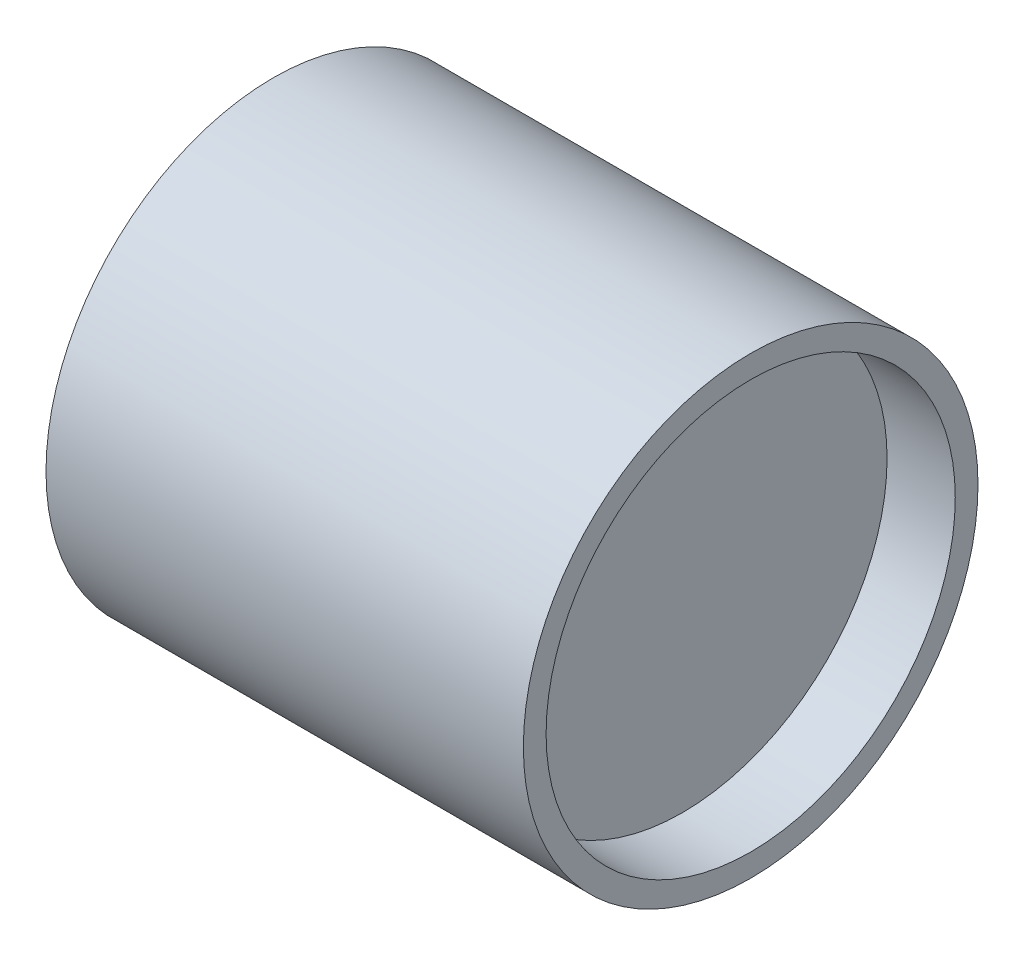
ISO-10303-21;
HEADER;
FILE_DESCRIPTION(('STEP AP214'),'2;1');
FILE_NAME('part.step','',(''),(''),'','','');
FILE_SCHEMA(('AUTOMOTIVE_DESIGN { 1 0 10303 214 1 1 1 1 }'));
ENDSEC;
DATA;
#1=APPLICATION_CONTEXT('core data for automotive mechanical design processes');
#2=APPLICATION_PROTOCOL_DEFINITION('international standard','automotive_design',2000,#1);
#3=PRODUCT_CONTEXT('',#1,'mechanical');
#4=PRODUCT('Part','Part','',(#3));
#5=PRODUCT_RELATED_PRODUCT_CATEGORY('part','',(#4));
#6=PRODUCT_DEFINITION_FORMATION('','',#4);
#7=PRODUCT_DEFINITION_CONTEXT('part definition',#1,'design');
#8=PRODUCT_DEFINITION('design','',#6,#7);
#9=PRODUCT_DEFINITION_SHAPE('','',#8);
#10=(LENGTH_UNIT() NAMED_UNIT(*) SI_UNIT(.MILLI.,.METRE.));
#11=(NAMED_UNIT(*) PLANE_ANGLE_UNIT() SI_UNIT($,.RADIAN.));
#12=(NAMED_UNIT(*) SI_UNIT($,.STERADIAN.) SOLID_ANGLE_UNIT());
#13=UNCERTAINTY_MEASURE_WITH_UNIT(LENGTH_MEASURE(1.E-05),#10,'distance_accuracy_value','');
#14=(GEOMETRIC_REPRESENTATION_CONTEXT(3) GLOBAL_UNCERTAINTY_ASSIGNED_CONTEXT((#13)) GLOBAL_UNIT_ASSIGNED_CONTEXT((#10,
#11,#12)) REPRESENTATION_CONTEXT('',''));
#15=CARTESIAN_POINT('',(0.,0.,0.));
#16=DIRECTION('',(0.,0.,1.));
#17=DIRECTION('',(1.,0.,0.));
#18=AXIS2_PLACEMENT_3D('',#15,#16,#17);
#19=CARTESIAN_POINT('',(-30.,0.,0.));
#20=DIRECTION('',(-1.,0.,0.));
#21=DIRECTION('',(0.,0.,1.));
#22=AXIS2_PLACEMENT_3D('',#19,#20,#21);
#23=CYLINDRICAL_SURFACE('',#22,9.);
#24=CARTESIAN_POINT('',(-10.,0.,0.));
#25=DIRECTION('',(-1.,0.,0.));
#26=DIRECTION('',(0.,0.,1.));
#27=AXIS2_PLACEMENT_3D('',#24,#25,#26);
#28=CIRCLE('',#27,9.);
#29=CARTESIAN_POINT('',(-10.,0.,9.));
#30=VERTEX_POINT('',#29);
#31=EDGE_CURVE('E10',#30,#30,#28,.T.);
#32=ORIENTED_EDGE('',*,*,#31,.F.);
#33=EDGE_LOOP('',(#32));
#34=FACE_BOUND('',#33,.T.);
#35=CARTESIAN_POINT('',(-13.,0.,0.));
#36=DIRECTION('',(-1.,0.,0.));
#37=DIRECTION('',(0.,0.,1.));
#38=AXIS2_PLACEMENT_3D('',#35,#36,#37);
#39=CIRCLE('',#38,9.);
#40=CARTESIAN_POINT('',(-13.,0.,9.));
#41=VERTEX_POINT('',#40);
#42=EDGE_CURVE('E53',#41,#41,#39,.T.);
#43=ORIENTED_EDGE('',*,*,#42,.T.);
#44=EDGE_LOOP('',(#43));
#45=FACE_BOUND('',#44,.T.);
#46=ADVANCED_FACE('F31',(#34,#45),#23,.F.);
#47=CARTESIAN_POINT('',(-10.,10.,0.));
#48=DIRECTION('',(-1.,0.,0.));
#49=DIRECTION('',(0.,0.,1.));
#50=AXIS2_PLACEMENT_3D('',#47,#48,#49);
#51=PLANE('',#50);
#52=CARTESIAN_POINT('',(-10.,0.,0.));
#53=DIRECTION('',(-1.,0.,0.));
#54=DIRECTION('',(0.,0.,1.));
#55=AXIS2_PLACEMENT_3D('',#52,#53,#54);
#56=CIRCLE('',#55,10.);
#57=CARTESIAN_POINT('',(-10.,0.,10.));
#58=VERTEX_POINT('',#57);
#59=EDGE_CURVE('E37',#58,#58,#56,.T.);
#60=ORIENTED_EDGE('',*,*,#59,.F.);
#61=EDGE_LOOP('',(#60));
#62=FACE_BOUND('',#61,.T.);
#63=ORIENTED_EDGE('',*,*,#31,.T.);
#64=EDGE_LOOP('',(#63));
#65=FACE_BOUND('',#64,.T.);
#66=ADVANCED_FACE('F69',(#62,#65),#51,.F.);
#67=CARTESIAN_POINT('',(-30.,0.,0.));
#68=DIRECTION('',(-1.,0.,0.));
#69=DIRECTION('',(0.,0.,1.));
#70=AXIS2_PLACEMENT_3D('',#67,#68,#69);
#71=CYLINDRICAL_SURFACE('',#70,10.);
#72=CARTESIAN_POINT('',(-31.,0.,0.));
#73=DIRECTION('',(-1.,0.,0.));
#74=DIRECTION('',(0.,0.,1.));
#75=AXIS2_PLACEMENT_3D('',#72,#73,#74);
#76=CIRCLE('',#75,10.);
#77=CARTESIAN_POINT('',(-31.,0.,10.));
#78=VERTEX_POINT('',#77);
#79=EDGE_CURVE('E41',#78,#78,#76,.T.);
#80=ORIENTED_EDGE('',*,*,#79,.F.);
#81=EDGE_LOOP('',(#80));
#82=FACE_BOUND('',#81,.T.);
#83=ORIENTED_EDGE('',*,*,#59,.T.);
#84=EDGE_LOOP('',(#83));
#85=FACE_BOUND('',#84,.T.);
#86=ADVANCED_FACE('F74',(#82,#85),#71,.T.);
#87=CARTESIAN_POINT('',(-31.,9.,0.));
#88=DIRECTION('',(1.,0.,0.));
#89=DIRECTION('',(0.,0.,-1.));
#90=AXIS2_PLACEMENT_3D('',#87,#88,#89);
#91=PLANE('',#90);
#92=CARTESIAN_POINT('',(-31.,0.,0.));
#93=DIRECTION('',(-1.,0.,0.));
#94=DIRECTION('',(0.,0.,1.));
#95=AXIS2_PLACEMENT_3D('',#92,#93,#94);
#96=CIRCLE('',#95,9.);
#97=CARTESIAN_POINT('',(-31.,0.,9.));
#98=VERTEX_POINT('',#97);
#99=EDGE_CURVE('E45',#98,#98,#96,.T.);
#100=ORIENTED_EDGE('',*,*,#99,.F.);
#101=EDGE_LOOP('',(#100));
#102=FACE_BOUND('',#101,.T.);
#103=ORIENTED_EDGE('',*,*,#79,.T.);
#104=EDGE_LOOP('',(#103));
#105=FACE_BOUND('',#104,.T.);
#106=ADVANCED_FACE('F79',(#102,#105),#91,.F.);
#107=CARTESIAN_POINT('',(-30.,0.,0.));
#108=DIRECTION('',(-1.,0.,0.));
#109=DIRECTION('',(0.,0.,1.));
#110=AXIS2_PLACEMENT_3D('',#107,#108,#109);
#111=CYLINDRICAL_SURFACE('',#110,9.);
#112=CARTESIAN_POINT('',(-28.,0.,0.));
#113=DIRECTION('',(-1.,0.,0.));
#114=DIRECTION('',(0.,0.,1.));
#115=AXIS2_PLACEMENT_3D('',#112,#113,#114);
#116=CIRCLE('',#115,9.);
#117=CARTESIAN_POINT('',(-28.,0.,9.));
#118=VERTEX_POINT('',#117);
#119=EDGE_CURVE('E50',#118,#118,#116,.T.);
#120=ORIENTED_EDGE('',*,*,#119,.F.);
#121=EDGE_LOOP('',(#120));
#122=FACE_BOUND('',#121,.T.);
#123=ORIENTED_EDGE('',*,*,#99,.T.);
#124=EDGE_LOOP('',(#123));
#125=FACE_BOUND('',#124,.T.);
#126=ADVANCED_FACE('F65',(#122,#125),#111,.F.);
#127=CARTESIAN_POINT('',(-28.,0.,0.));
#128=DIRECTION('',(1.,0.,0.));
#129=DIRECTION('',(0.,0.,-1.));
#130=AXIS2_PLACEMENT_3D('',#127,#128,#129);
#131=PLANE('',#130);
#132=ORIENTED_EDGE('',*,*,#119,.T.);
#133=EDGE_LOOP('',(#132));
#134=FACE_BOUND('',#133,.T.);
#135=ADVANCED_FACE('F60',(#134),#131,.F.);
#136=CARTESIAN_POINT('',(-13.,9.,0.));
#137=DIRECTION('',(-1.,0.,0.));
#138=DIRECTION('',(0.,0.,1.));
#139=AXIS2_PLACEMENT_3D('',#136,#137,#138);
#140=PLANE('',#139);
#141=ORIENTED_EDGE('',*,*,#42,.F.);
#142=EDGE_LOOP('',(#141));
#143=FACE_BOUND('',#142,.T.);
#144=ADVANCED_FACE('F58',(#143),#140,.F.);
#145=CLOSED_SHELL('',(#46,#66,#86,#106,#126,#135,#144));
#146=MANIFOLD_SOLID_BREP('B2',#145);
#147=ADVANCED_BREP_SHAPE_REPRESENTATION('',(#18,#146),#14);
#148=SHAPE_DEFINITION_REPRESENTATION(#9,#147);
ENDSEC;
END-ISO-10303-21;
